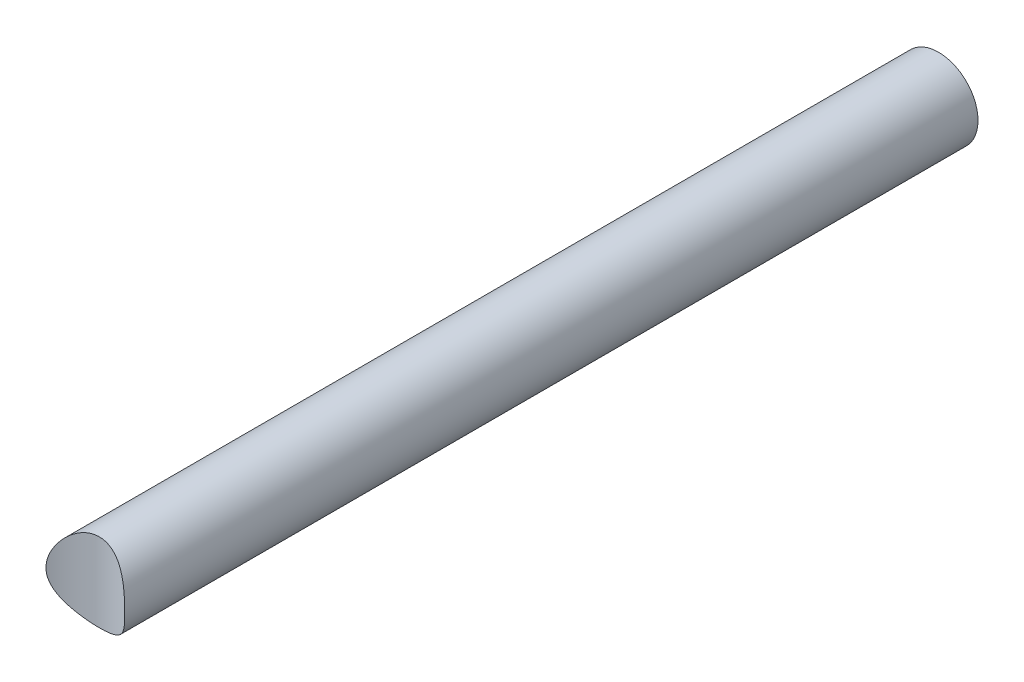
ISO-10303-21;
HEADER;
FILE_DESCRIPTION(('STEP AP214'),'2;1');
FILE_NAME('part.step','',(''),(''),'','','');
FILE_SCHEMA(('AUTOMOTIVE_DESIGN { 1 0 10303 214 1 1 1 1 }'));
ENDSEC;
DATA;
#1=APPLICATION_CONTEXT('core data for automotive mechanical design processes');
#2=APPLICATION_PROTOCOL_DEFINITION('international standard','automotive_design',2000,#1);
#3=PRODUCT_CONTEXT('',#1,'mechanical');
#4=PRODUCT('Part','Part','',(#3));
#5=PRODUCT_RELATED_PRODUCT_CATEGORY('part','',(#4));
#6=PRODUCT_DEFINITION_FORMATION('','',#4);
#7=PRODUCT_DEFINITION_CONTEXT('part definition',#1,'design');
#8=PRODUCT_DEFINITION('design','',#6,#7);
#9=PRODUCT_DEFINITION_SHAPE('','',#8);
#10=(LENGTH_UNIT() NAMED_UNIT(*) SI_UNIT(.MILLI.,.METRE.));
#11=(NAMED_UNIT(*) PLANE_ANGLE_UNIT() SI_UNIT($,.RADIAN.));
#12=(NAMED_UNIT(*) SI_UNIT($,.STERADIAN.) SOLID_ANGLE_UNIT());
#13=UNCERTAINTY_MEASURE_WITH_UNIT(LENGTH_MEASURE(1.E-05),#10,'distance_accuracy_value','');
#14=(GEOMETRIC_REPRESENTATION_CONTEXT(3) GLOBAL_UNCERTAINTY_ASSIGNED_CONTEXT((#13)) GLOBAL_UNIT_ASSIGNED_CONTEXT((#10,
#11,#12)) REPRESENTATION_CONTEXT('',''));
#15=CARTESIAN_POINT('',(0.,0.,0.));
#16=DIRECTION('',(0.,0.,1.));
#17=DIRECTION('',(1.,0.,0.));
#18=AXIS2_PLACEMENT_3D('',#15,#16,#17);
#19=CARTESIAN_POINT('',(60.486,-3.59,-13.526));
#20=DIRECTION('',(0.,1.,0.));
#21=DIRECTION('',(0.,0.,1.));
#22=AXIS2_PLACEMENT_3D('',#19,#20,#21);
#23=CYLINDRICAL_SURFACE('',#22,0.81);
#24=CARTESIAN_POINT('',(60.996,-0.61,-14.1552853089021));
#25=CARTESIAN_POINT('',(60.9960002238567,-0.635334210969195,-14.1552850510501));
#26=CARTESIAN_POINT('',(60.9940989827788,-0.660667409048047,-14.1568402100914));
#27=CARTESIAN_POINT('',(60.9866427379852,-0.7104621550628,-14.1627717720581));
#28=CARTESIAN_POINT('',(60.9810826930388,-0.734922451190749,-14.1671520673915));
#29=CARTESIAN_POINT('',(60.9667069739673,-0.782120557410308,-14.1779970150055));
#30=CARTESIAN_POINT('',(60.9579181524729,-0.804870761239623,-14.1844444210762));
#31=CARTESIAN_POINT('',(60.937416335702,-0.848549846927483,-14.1986654266323));
#32=CARTESIAN_POINT('',(60.9257025807963,-0.869478253743271,-14.206439370464));
#33=CARTESIAN_POINT('',(60.8978243970523,-0.912048561052362,-14.2237137673588));
#34=CARTESIAN_POINT('',(60.8812709436509,-0.933398860793801,-14.2333051178967));
#35=CARTESIAN_POINT('',(60.8449769171481,-0.973267117125198,-14.2523999309199));
#36=CARTESIAN_POINT('',(60.8252336475543,-0.991782651342423,-14.2619033117903));
#37=CARTESIAN_POINT('',(60.7801789282669,-1.02771688783599,-14.2811353832702));
#38=CARTESIAN_POINT('',(60.754481195514,-1.04471981769079,-14.2907477334657));
#39=CARTESIAN_POINT('',(60.6998689408941,-1.07402283260454,-14.3077768707304));
#40=CARTESIAN_POINT('',(60.6709576890234,-1.08632764280083,-14.3151958620676));
#41=CARTESIAN_POINT('',(60.6138749568506,-1.10452059545482,-14.326315266971));
#42=CARTESIAN_POINT('',(60.5859330932605,-1.11093843744663,-14.3303196048114));
#43=CARTESIAN_POINT('',(60.5291148328987,-1.11898101270464,-14.3353523870354));
#44=CARTESIAN_POINT('',(60.5002394706951,-1.12061087987497,-14.3363840188794));
#45=CARTESIAN_POINT('',(60.446624705242,-1.11908663661352,-14.3354254753373));
#46=CARTESIAN_POINT('',(60.4218574162432,-1.11655361443703,-14.3338275719978));
#47=CARTESIAN_POINT('',(60.3731818460782,-1.10797856390051,-14.3284782676875));
#48=CARTESIAN_POINT('',(60.3492736293138,-1.10193627304231,-14.3247267056204));
#49=CARTESIAN_POINT('',(60.3028621420961,-1.08661257963502,-14.3153812505501));
#50=CARTESIAN_POINT('',(60.2803616467855,-1.07732500280611,-14.3097838469133));
#51=CARTESIAN_POINT('',(60.2372226806441,-1.05585975221759,-14.2971780165647));
#52=CARTESIAN_POINT('',(60.2165846395271,-1.04368141382959,-14.2901692654197));
#53=CARTESIAN_POINT('',(60.17498061057,-1.01507028966428,-14.2742798557332));
#54=CARTESIAN_POINT('',(60.1542977329032,-0.998295577281929,-14.2652746808701));
#55=CARTESIAN_POINT('',(60.1158606944377,-0.961851982224756,-14.2468001152233));
#56=CARTESIAN_POINT('',(60.0981107305647,-0.942179027042252,-14.2373300839333));
#57=CARTESIAN_POINT('',(60.0636364919817,-0.897420033233038,-14.2174872143176));
#58=CARTESIAN_POINT('',(60.047363464833,-0.871962023167096,-14.2071620576787));
#59=CARTESIAN_POINT('',(60.019378289116,-0.818045972948542,-14.1883064029464));
#60=CARTESIAN_POINT('',(60.0076595577982,-0.789592338877653,-14.1797733228642));
#61=CARTESIAN_POINT('',(59.9911898458261,-0.736045381179701,-14.1673646403878));
#62=CARTESIAN_POINT('',(59.9855280962452,-0.711371265076984,-14.16290659857));
#63=CARTESIAN_POINT('',(59.9779366374697,-0.66112996333589,-14.1568696481011));
#64=CARTESIAN_POINT('',(59.9760002258913,-0.635564465975083,-14.1552855690976));
#65=CARTESIAN_POINT('',(59.9759997761433,-0.584665789030803,-14.1552850510501));
#66=CARTESIAN_POINT('',(59.9779010172212,-0.559332590951951,-14.1568402100914));
#67=CARTESIAN_POINT('',(59.9853572620148,-0.509537844937199,-14.1627717720581));
#68=CARTESIAN_POINT('',(59.9909173069612,-0.485077548809251,-14.1671520673915));
#69=CARTESIAN_POINT('',(60.0052930260327,-0.437879442589692,-14.1779970150055));
#70=CARTESIAN_POINT('',(60.0140818475271,-0.415129238760377,-14.1844444210762));
#71=CARTESIAN_POINT('',(60.034583664298,-0.371450153072516,-14.1986654266323));
#72=CARTESIAN_POINT('',(60.0462974192037,-0.350521746256729,-14.206439370464));
#73=CARTESIAN_POINT('',(60.0741756029477,-0.307951438947638,-14.2237137673588));
#74=CARTESIAN_POINT('',(60.0907290563491,-0.286601139206199,-14.2333051178967));
#75=CARTESIAN_POINT('',(60.1270230828519,-0.246732882874802,-14.2523999309199));
#76=CARTESIAN_POINT('',(60.1467663524456,-0.228217348657577,-14.2619033117903));
#77=CARTESIAN_POINT('',(60.1918210717331,-0.192283112164012,-14.2811353832702));
#78=CARTESIAN_POINT('',(60.217518804486,-0.175280182309215,-14.2907477334657));
#79=CARTESIAN_POINT('',(60.2721310591059,-0.145977167395464,-14.3077768707304));
#80=CARTESIAN_POINT('',(60.3010423109766,-0.133672357199167,-14.3151958620676));
#81=CARTESIAN_POINT('',(60.3581250431495,-0.115479404545181,-14.326315266971));
#82=CARTESIAN_POINT('',(60.3860669067395,-0.109061562553364,-14.3303196048114));
#83=CARTESIAN_POINT('',(60.4428851671013,-0.101018987295363,-14.3353523870354));
#84=CARTESIAN_POINT('',(60.4717605293049,-0.0993891201250345,-14.3363840188794));
#85=CARTESIAN_POINT('',(60.525375294758,-0.100913363386476,-14.3354254753373));
#86=CARTESIAN_POINT('',(60.5501425837568,-0.103446385562968,-14.3338275719978));
#87=CARTESIAN_POINT('',(60.5988181539218,-0.112021436099488,-14.3284782676875));
#88=CARTESIAN_POINT('',(60.6227263706862,-0.118063726957691,-14.3247267056204));
#89=CARTESIAN_POINT('',(60.6691378579039,-0.133387420364981,-14.3153812505501));
#90=CARTESIAN_POINT('',(60.6916383532145,-0.142674997193891,-14.3097838469133));
#91=CARTESIAN_POINT('',(60.7347773193559,-0.164140247782414,-14.2971780165647));
#92=CARTESIAN_POINT('',(60.7554153604729,-0.176318586170413,-14.2901692654197));
#93=CARTESIAN_POINT('',(60.79701938943,-0.204929710335716,-14.2742798557332));
#94=CARTESIAN_POINT('',(60.8177022670968,-0.221704422718071,-14.2652746808701));
#95=CARTESIAN_POINT('',(60.8561393055623,-0.258148017775243,-14.2468001152233));
#96=CARTESIAN_POINT('',(60.8738892694353,-0.277820972957748,-14.2373300839333));
#97=CARTESIAN_POINT('',(60.9083635080183,-0.322579966766962,-14.2174872143176));
#98=CARTESIAN_POINT('',(60.924636535167,-0.348037976832904,-14.2071620576787));
#99=CARTESIAN_POINT('',(60.952621710884,-0.401954027051458,-14.1883064029464));
#100=CARTESIAN_POINT('',(60.9643404422018,-0.430407661122347,-14.1797733228642));
#101=CARTESIAN_POINT('',(60.9808101541739,-0.483954618820299,-14.1673646403878));
#102=CARTESIAN_POINT('',(60.9864719037548,-0.508628734923015,-14.16290659857));
#103=CARTESIAN_POINT('',(60.9940633625303,-0.558870036664108,-14.1568696481011));
#104=CARTESIAN_POINT('',(60.9959997741087,-0.584435534024916,-14.1552855690976));
#105=CARTESIAN_POINT('',(60.996,-0.61,-14.1552853089021));
#106=B_SPLINE_CURVE_WITH_KNOTS('',3,(#24,#25,#26,#27,#28,#29,#30,#31,#32,#33,#34,#35,#36,#37,
#38,#39,#40,#41,#42,#43,#44,#45,#46,#47,#48,#49,#50,#51,#52,#53,#54,#55,#56,#57,#58,#59,#60,#61,
#62,#63,#64,#65,#66,#67,#68,#69,#70,#71,#72,#73,#74,#75,#76,#77,#78,#79,#80,#81,#82,#83,#84,#85,
#86,#87,#88,#89,#90,#91,#92,#93,#94,#95,#96,#97,#98,#99,#100,#101,#102,#103,#104,#105),
.UNSPECIFIED.,.T.,.F.,(4,2,2,2,2,2,2,2,2,2,2,2,2,2,2,2,2,2,2,2,2,2,2,2,2,2,2,2,2,2,2,2,2,2,2,2,
2,2,2,2,4),(0.,0.075891482102052,0.151887749757776,0.227265784747846,0.302663416428801,
0.3883384776572,0.474086346424379,0.570392434373001,0.666601405644625,0.752917585622714,
0.839141179267411,0.913626180330782,0.988116753693469,1.06274982685914,1.13740007590933,
1.22140681777028,1.30553274917158,1.4008598920815,1.49604873271247,1.57276812767887,
1.64934936458243,1.72524084668448,1.8012371143402,1.87661514933027,1.95201278101123,
2.03768784223963,2.12343571100681,2.21974179895543,2.31595077022705,2.40226695020515,
2.48849054384984,2.56297554491321,2.6374661182759,2.71209919144157,2.78674944049176,
2.8707561823527,2.95488211375401,3.05020925666392,3.1453980972949,3.2221174922613,
3.29869872916485),.UNSPECIFIED.);
#107=CARTESIAN_POINT('',(60.996,-0.61,-14.1552853089021));
#108=VERTEX_POINT('',#107);
#109=EDGE_CURVE('E18',#108,#108,#106,.T.);
#110=ORIENTED_EDGE('',*,*,#109,.F.);
#111=EDGE_LOOP('',(#110));
#112=FACE_BOUND('',#111,.T.);
#113=ADVANCED_FACE('F14',(#112),#23,.F.);
#114=CARTESIAN_POINT('',(60.486,-0.61,-25.2));
#115=DIRECTION('',(0.,0.,-1.));
#116=DIRECTION('',(-1.,0.,0.));
#117=AXIS2_PLACEMENT_3D('',#114,#115,#116);
#118=PLANE('',#117);
#119=CARTESIAN_POINT('',(60.486,-0.61,-25.2));
#120=DIRECTION('',(0.,0.,1.));
#121=DIRECTION('',(1.,0.,0.));
#122=AXIS2_PLACEMENT_3D('',#119,#120,#121);
#123=CIRCLE('',#122,0.51);
#124=CARTESIAN_POINT('',(60.996,-0.61,-25.2));
#125=VERTEX_POINT('',#124);
#126=EDGE_CURVE('E10',#125,#125,#123,.T.);
#127=ORIENTED_EDGE('',*,*,#126,.F.);
#128=EDGE_LOOP('',(#127));
#129=FACE_BOUND('',#128,.T.);
#130=ADVANCED_FACE('F33',(#129),#118,.T.);
#131=CARTESIAN_POINT('',(60.486,-0.61,-9.526));
#132=DIRECTION('',(0.,0.,1.));
#133=DIRECTION('',(1.,0.,0.));
#134=AXIS2_PLACEMENT_3D('',#131,#132,#133);
#135=CYLINDRICAL_SURFACE('',#134,0.51);
#136=ORIENTED_EDGE('',*,*,#109,.T.);
#137=EDGE_LOOP('',(#136));
#138=FACE_BOUND('',#137,.T.);
#139=ORIENTED_EDGE('',*,*,#126,.T.);
#140=EDGE_LOOP('',(#139));
#141=FACE_BOUND('',#140,.T.);
#142=ADVANCED_FACE('F30',(#138,#141),#135,.T.);
#143=CLOSED_SHELL('',(#113,#130,#142));
#144=MANIFOLD_SOLID_BREP('B1',#143);
#145=ADVANCED_BREP_SHAPE_REPRESENTATION('',(#18,#144),#14);
#146=SHAPE_DEFINITION_REPRESENTATION(#9,#145);
ENDSEC;
END-ISO-10303-21;
